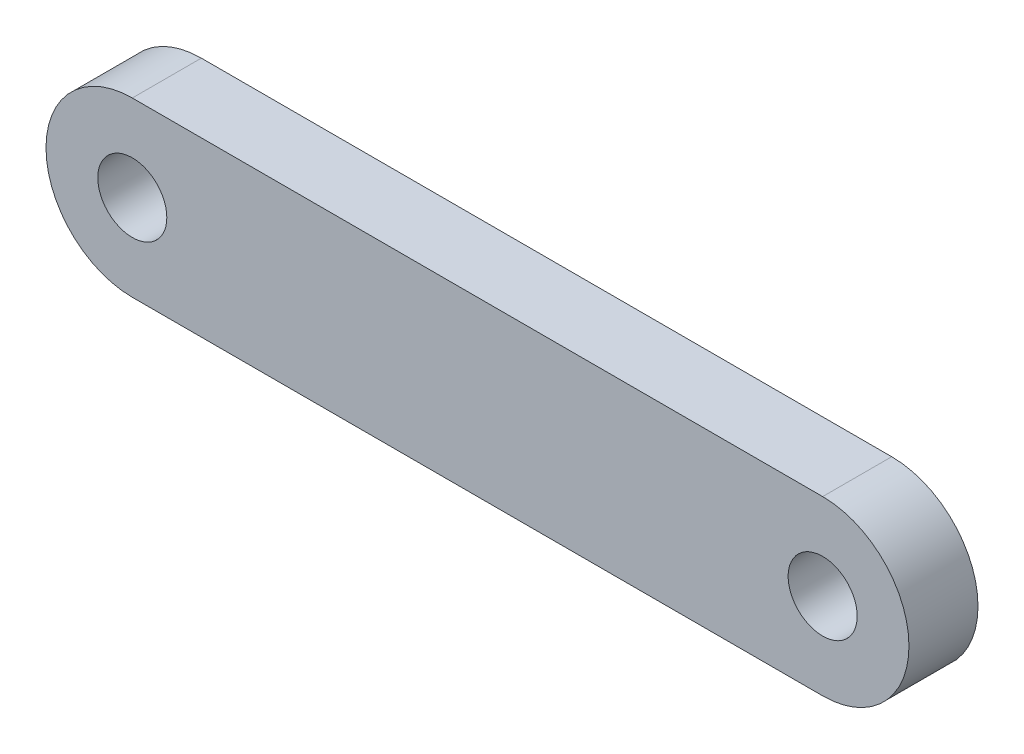
ISO-10303-21;
HEADER;
FILE_DESCRIPTION(('STEP AP214'),'2;1');
FILE_NAME('part.step','',(''),(''),'','','');
FILE_SCHEMA(('AUTOMOTIVE_DESIGN { 1 0 10303 214 1 1 1 1 }'));
ENDSEC;
DATA;
#1=APPLICATION_CONTEXT('core data for automotive mechanical design processes');
#2=APPLICATION_PROTOCOL_DEFINITION('international standard','automotive_design',2000,#1);
#3=PRODUCT_CONTEXT('',#1,'mechanical');
#4=PRODUCT('Part','Part','',(#3));
#5=PRODUCT_RELATED_PRODUCT_CATEGORY('part','',(#4));
#6=PRODUCT_DEFINITION_FORMATION('','',#4);
#7=PRODUCT_DEFINITION_CONTEXT('part definition',#1,'design');
#8=PRODUCT_DEFINITION('design','',#6,#7);
#9=PRODUCT_DEFINITION_SHAPE('','',#8);
#10=(LENGTH_UNIT() NAMED_UNIT(*) SI_UNIT(.MILLI.,.METRE.));
#11=(NAMED_UNIT(*) PLANE_ANGLE_UNIT() SI_UNIT($,.RADIAN.));
#12=(NAMED_UNIT(*) SI_UNIT($,.STERADIAN.) SOLID_ANGLE_UNIT());
#13=UNCERTAINTY_MEASURE_WITH_UNIT(LENGTH_MEASURE(1.E-05),#10,'distance_accuracy_value','');
#14=(GEOMETRIC_REPRESENTATION_CONTEXT(3) GLOBAL_UNCERTAINTY_ASSIGNED_CONTEXT((#13)) GLOBAL_UNIT_ASSIGNED_CONTEXT((#10,
#11,#12)) REPRESENTATION_CONTEXT('',''));
#15=CARTESIAN_POINT('',(0.,0.,0.));
#16=DIRECTION('',(0.,0.,1.));
#17=DIRECTION('',(1.,0.,0.));
#18=AXIS2_PLACEMENT_3D('',#15,#16,#17);
#19=CARTESIAN_POINT('',(0.,0.,4.));
#20=DIRECTION('',(0.,0.,1.));
#21=DIRECTION('',(1.,0.,0.));
#22=AXIS2_PLACEMENT_3D('',#19,#20,#21);
#23=PLANE('',#22);
#24=CARTESIAN_POINT('',(40.,0.,4.));
#25=DIRECTION('',(0.,0.,1.));
#26=DIRECTION('',(1.,0.,0.));
#27=AXIS2_PLACEMENT_3D('',#24,#25,#26);
#28=CIRCLE('',#27,2.);
#29=CARTESIAN_POINT('',(42.,0.,4.));
#30=VERTEX_POINT('',#29);
#31=EDGE_CURVE('E100',#30,#30,#28,.T.);
#32=ORIENTED_EDGE('',*,*,#31,.F.);
#33=EDGE_LOOP('',(#32));
#34=FACE_BOUND('',#33,.T.);
#35=CARTESIAN_POINT('',(0.,0.,4.));
#36=DIRECTION('',(0.,0.,1.));
#37=DIRECTION('',(1.,0.,0.));
#38=AXIS2_PLACEMENT_3D('',#35,#36,#37);
#39=CIRCLE('',#38,5.);
#40=CARTESIAN_POINT('',(0.,5.,4.));
#41=VERTEX_POINT('',#40);
#42=CARTESIAN_POINT('',(0.,-5.,4.));
#43=VERTEX_POINT('',#42);
#44=EDGE_CURVE('E85',#41,#43,#39,.T.);
#45=ORIENTED_EDGE('',*,*,#44,.T.);
#46=DIRECTION('',(1.,0.,0.));
#47=VECTOR('',#46,1.);
#48=CARTESIAN_POINT('',(0.,-5.,4.));
#49=LINE('',#48,#47);
#50=CARTESIAN_POINT('',(40.,-5.,4.));
#51=VERTEX_POINT('',#50);
#52=EDGE_CURVE('E80',#43,#51,#49,.T.);
#53=ORIENTED_EDGE('',*,*,#52,.T.);
#54=CARTESIAN_POINT('',(40.,0.,4.));
#55=DIRECTION('',(0.,0.,1.));
#56=DIRECTION('',(1.,0.,0.));
#57=AXIS2_PLACEMENT_3D('',#54,#55,#56);
#58=CIRCLE('',#57,5.);
#59=CARTESIAN_POINT('',(40.,5.,4.));
#60=VERTEX_POINT('',#59);
#61=EDGE_CURVE('E83',#51,#60,#58,.T.);
#62=ORIENTED_EDGE('',*,*,#61,.T.);
#63=DIRECTION('',(-1.,0.,0.));
#64=VECTOR('',#63,1.);
#65=CARTESIAN_POINT('',(0.,5.,4.));
#66=LINE('',#65,#64);
#67=EDGE_CURVE('E50',#60,#41,#66,.T.);
#68=ORIENTED_EDGE('',*,*,#67,.T.);
#69=EDGE_LOOP('',(#45,#53,#62,#68));
#70=FACE_BOUND('',#69,.T.);
#71=CARTESIAN_POINT('',(0.,0.,4.));
#72=DIRECTION('',(0.,0.,1.));
#73=DIRECTION('',(1.,0.,0.));
#74=AXIS2_PLACEMENT_3D('',#71,#72,#73);
#75=CIRCLE('',#74,2.);
#76=CARTESIAN_POINT('',(2.,0.,4.));
#77=VERTEX_POINT('',#76);
#78=EDGE_CURVE('E115',#77,#77,#75,.T.);
#79=ORIENTED_EDGE('',*,*,#78,.F.);
#80=EDGE_LOOP('',(#79));
#81=FACE_BOUND('',#80,.T.);
#82=ADVANCED_FACE('F33',(#34,#70,#81),#23,.T.);
#83=CARTESIAN_POINT('',(0.,0.,0.));
#84=DIRECTION('',(0.,0.,1.));
#85=DIRECTION('',(1.,0.,0.));
#86=AXIS2_PLACEMENT_3D('',#83,#84,#85);
#87=PLANE('',#86);
#88=CARTESIAN_POINT('',(0.,0.,0.));
#89=DIRECTION('',(0.,0.,1.));
#90=DIRECTION('',(1.,0.,0.));
#91=AXIS2_PLACEMENT_3D('',#88,#89,#90);
#92=CIRCLE('',#91,5.);
#93=CARTESIAN_POINT('',(0.,5.,0.));
#94=VERTEX_POINT('',#93);
#95=CARTESIAN_POINT('',(0.,-5.,0.));
#96=VERTEX_POINT('',#95);
#97=EDGE_CURVE('E97',#94,#96,#92,.T.);
#98=ORIENTED_EDGE('',*,*,#97,.F.);
#99=DIRECTION('',(-1.,0.,0.));
#100=VECTOR('',#99,1.);
#101=CARTESIAN_POINT('',(0.,5.,0.));
#102=LINE('',#101,#100);
#103=CARTESIAN_POINT('',(40.,5.,0.));
#104=VERTEX_POINT('',#103);
#105=EDGE_CURVE('E73',#104,#94,#102,.T.);
#106=ORIENTED_EDGE('',*,*,#105,.F.);
#107=CARTESIAN_POINT('',(40.,0.,0.));
#108=DIRECTION('',(0.,0.,1.));
#109=DIRECTION('',(1.,0.,0.));
#110=AXIS2_PLACEMENT_3D('',#107,#108,#109);
#111=CIRCLE('',#110,5.);
#112=CARTESIAN_POINT('',(40.,-5.,0.));
#113=VERTEX_POINT('',#112);
#114=EDGE_CURVE('E67',#113,#104,#111,.T.);
#115=ORIENTED_EDGE('',*,*,#114,.F.);
#116=DIRECTION('',(1.,0.,0.));
#117=VECTOR('',#116,1.);
#118=CARTESIAN_POINT('',(0.,-5.,0.));
#119=LINE('',#118,#117);
#120=EDGE_CURVE('E89',#96,#113,#119,.T.);
#121=ORIENTED_EDGE('',*,*,#120,.F.);
#122=EDGE_LOOP('',(#98,#106,#115,#121));
#123=FACE_BOUND('',#122,.T.);
#124=CARTESIAN_POINT('',(40.,0.,0.));
#125=DIRECTION('',(0.,0.,1.));
#126=DIRECTION('',(1.,0.,0.));
#127=AXIS2_PLACEMENT_3D('',#124,#125,#126);
#128=CIRCLE('',#127,2.);
#129=CARTESIAN_POINT('',(42.,0.,0.));
#130=VERTEX_POINT('',#129);
#131=EDGE_CURVE('E112',#130,#130,#128,.T.);
#132=ORIENTED_EDGE('',*,*,#131,.T.);
#133=EDGE_LOOP('',(#132));
#134=FACE_BOUND('',#133,.T.);
#135=CARTESIAN_POINT('',(0.,0.,0.));
#136=DIRECTION('',(0.,0.,1.));
#137=DIRECTION('',(1.,0.,0.));
#138=AXIS2_PLACEMENT_3D('',#135,#136,#137);
#139=CIRCLE('',#138,2.);
#140=CARTESIAN_POINT('',(2.,0.,0.));
#141=VERTEX_POINT('',#140);
#142=EDGE_CURVE('E118',#141,#141,#139,.T.);
#143=ORIENTED_EDGE('',*,*,#142,.T.);
#144=EDGE_LOOP('',(#143));
#145=FACE_BOUND('',#144,.T.);
#146=ADVANCED_FACE('F108',(#123,#134,#145),#87,.F.);
#147=CARTESIAN_POINT('',(0.,0.,4.));
#148=DIRECTION('',(0.,0.,-1.));
#149=DIRECTION('',(-1.,0.,0.));
#150=AXIS2_PLACEMENT_3D('',#147,#148,#149);
#151=CYLINDRICAL_SURFACE('',#150,5.);
#152=ORIENTED_EDGE('',*,*,#97,.T.);
#153=DIRECTION('',(0.,0.,-1.));
#154=VECTOR('',#153,1.);
#155=CARTESIAN_POINT('',(0.,-5.,4.));
#156=LINE('',#155,#154);
#157=EDGE_CURVE('E11',#43,#96,#156,.T.);
#158=ORIENTED_EDGE('',*,*,#157,.F.);
#159=ORIENTED_EDGE('',*,*,#44,.F.);
#160=DIRECTION('',(0.,0.,-1.));
#161=VECTOR('',#160,1.);
#162=CARTESIAN_POINT('',(0.,5.,4.));
#163=LINE('',#162,#161);
#164=EDGE_CURVE('E93',#41,#94,#163,.T.);
#165=ORIENTED_EDGE('',*,*,#164,.T.);
#166=EDGE_LOOP('',(#152,#158,#159,#165));
#167=FACE_BOUND('',#166,.T.);
#168=ADVANCED_FACE('F35',(#167),#151,.T.);
#169=CARTESIAN_POINT('',(0.,-5.,4.));
#170=DIRECTION('',(0.,1.,0.));
#171=DIRECTION('',(0.,0.,1.));
#172=AXIS2_PLACEMENT_3D('',#169,#170,#171);
#173=PLANE('',#172);
#174=ORIENTED_EDGE('',*,*,#120,.T.);
#175=DIRECTION('',(0.,0.,-1.));
#176=VECTOR('',#175,1.);
#177=CARTESIAN_POINT('',(40.,-5.,4.));
#178=LINE('',#177,#176);
#179=EDGE_CURVE('E42',#51,#113,#178,.T.);
#180=ORIENTED_EDGE('',*,*,#179,.F.);
#181=ORIENTED_EDGE('',*,*,#52,.F.);
#182=ORIENTED_EDGE('',*,*,#157,.T.);
#183=EDGE_LOOP('',(#174,#180,#181,#182));
#184=FACE_BOUND('',#183,.T.);
#185=ADVANCED_FACE('F88',(#184),#173,.F.);
#186=CARTESIAN_POINT('',(40.,0.,4.));
#187=DIRECTION('',(0.,0.,-1.));
#188=DIRECTION('',(-1.,0.,0.));
#189=AXIS2_PLACEMENT_3D('',#186,#187,#188);
#190=CYLINDRICAL_SURFACE('',#189,5.);
#191=ORIENTED_EDGE('',*,*,#114,.T.);
#192=DIRECTION('',(0.,0.,-1.));
#193=VECTOR('',#192,1.);
#194=CARTESIAN_POINT('',(40.,5.,4.));
#195=LINE('',#194,#193);
#196=EDGE_CURVE('E90',#60,#104,#195,.T.);
#197=ORIENTED_EDGE('',*,*,#196,.F.);
#198=ORIENTED_EDGE('',*,*,#61,.F.);
#199=ORIENTED_EDGE('',*,*,#179,.T.);
#200=EDGE_LOOP('',(#191,#197,#198,#199));
#201=FACE_BOUND('',#200,.T.);
#202=ADVANCED_FACE('F91',(#201),#190,.T.);
#203=CARTESIAN_POINT('',(0.,5.,4.));
#204=DIRECTION('',(0.,-1.,0.));
#205=DIRECTION('',(0.,0.,-1.));
#206=AXIS2_PLACEMENT_3D('',#203,#204,#205);
#207=PLANE('',#206);
#208=ORIENTED_EDGE('',*,*,#105,.T.);
#209=ORIENTED_EDGE('',*,*,#164,.F.);
#210=ORIENTED_EDGE('',*,*,#67,.F.);
#211=ORIENTED_EDGE('',*,*,#196,.T.);
#212=EDGE_LOOP('',(#208,#209,#210,#211));
#213=FACE_BOUND('',#212,.T.);
#214=ADVANCED_FACE('F105',(#213),#207,.F.);
#215=CARTESIAN_POINT('',(40.,0.,4.));
#216=DIRECTION('',(0.,0.,-1.));
#217=DIRECTION('',(-1.,0.,0.));
#218=AXIS2_PLACEMENT_3D('',#215,#216,#217);
#219=CYLINDRICAL_SURFACE('',#218,2.);
#220=ORIENTED_EDGE('',*,*,#31,.T.);
#221=EDGE_LOOP('',(#220));
#222=FACE_BOUND('',#221,.T.);
#223=ORIENTED_EDGE('',*,*,#131,.F.);
#224=EDGE_LOOP('',(#223));
#225=FACE_BOUND('',#224,.T.);
#226=ADVANCED_FACE('F135',(#222,#225),#219,.F.);
#227=CARTESIAN_POINT('',(0.,0.,4.));
#228=DIRECTION('',(0.,0.,-1.));
#229=DIRECTION('',(-1.,0.,0.));
#230=AXIS2_PLACEMENT_3D('',#227,#228,#229);
#231=CYLINDRICAL_SURFACE('',#230,2.);
#232=ORIENTED_EDGE('',*,*,#78,.T.);
#233=EDGE_LOOP('',(#232));
#234=FACE_BOUND('',#233,.T.);
#235=ORIENTED_EDGE('',*,*,#142,.F.);
#236=EDGE_LOOP('',(#235));
#237=FACE_BOUND('',#236,.T.);
#238=ADVANCED_FACE('F124',(#234,#237),#231,.F.);
#239=CLOSED_SHELL('',(#82,#146,#168,#185,#202,#214,#226,#238));
#240=MANIFOLD_SOLID_BREP('B2',#239);
#241=ADVANCED_BREP_SHAPE_REPRESENTATION('',(#18,#240),#14);
#242=SHAPE_DEFINITION_REPRESENTATION(#9,#241);
ENDSEC;
END-ISO-10303-21;
